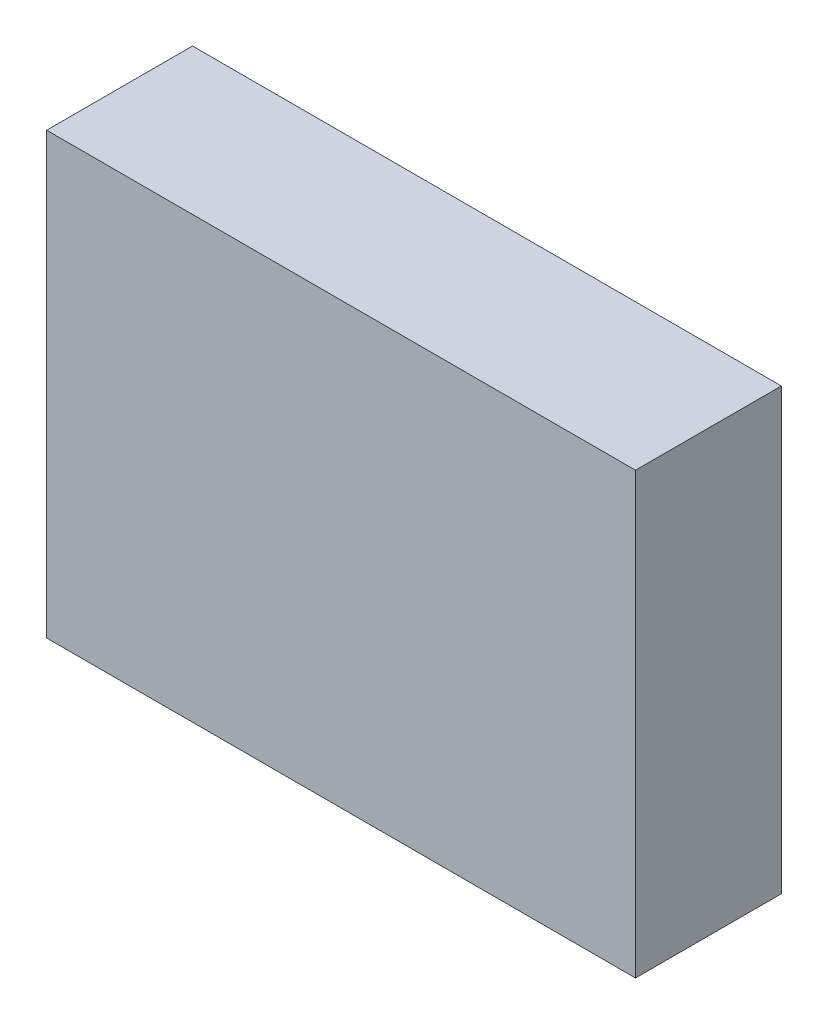
ISO-10303-21;
HEADER;
FILE_DESCRIPTION(('STEP AP214'),'2;1');
FILE_NAME('part.step','',(''),(''),'','','');
FILE_SCHEMA(('AUTOMOTIVE_DESIGN { 1 0 10303 214 1 1 1 1 }'));
ENDSEC;
DATA;
#1=APPLICATION_CONTEXT('core data for automotive mechanical design processes');
#2=APPLICATION_PROTOCOL_DEFINITION('international standard','automotive_design',2000,#1);
#3=PRODUCT_CONTEXT('',#1,'mechanical');
#4=PRODUCT('Part','Part','',(#3));
#5=PRODUCT_RELATED_PRODUCT_CATEGORY('part','',(#4));
#6=PRODUCT_DEFINITION_FORMATION('','',#4);
#7=PRODUCT_DEFINITION_CONTEXT('part definition',#1,'design');
#8=PRODUCT_DEFINITION('design','',#6,#7);
#9=PRODUCT_DEFINITION_SHAPE('','',#8);
#10=(LENGTH_UNIT() NAMED_UNIT(*) SI_UNIT(.MILLI.,.METRE.));
#11=(NAMED_UNIT(*) PLANE_ANGLE_UNIT() SI_UNIT($,.RADIAN.));
#12=(NAMED_UNIT(*) SI_UNIT($,.STERADIAN.) SOLID_ANGLE_UNIT());
#13=UNCERTAINTY_MEASURE_WITH_UNIT(LENGTH_MEASURE(1.E-05),#10,'distance_accuracy_value','');
#14=(GEOMETRIC_REPRESENTATION_CONTEXT(3) GLOBAL_UNCERTAINTY_ASSIGNED_CONTEXT((#13)) GLOBAL_UNIT_ASSIGNED_CONTEXT((#10,
#11,#12)) REPRESENTATION_CONTEXT('',''));
#15=CARTESIAN_POINT('',(0.,0.,0.));
#16=DIRECTION('',(0.,0.,1.));
#17=DIRECTION('',(1.,0.,0.));
#18=AXIS2_PLACEMENT_3D('',#15,#16,#17);
#19=CARTESIAN_POINT('',(30.2779637773868,-22.6120118343195,15.));
#20=DIRECTION('',(-1.,0.,0.));
#21=DIRECTION('',(0.,0.,1.));
#22=AXIS2_PLACEMENT_3D('',#19,#20,#21);
#23=PLANE('',#22);
#24=DIRECTION('',(0.,1.,0.));
#25=VECTOR('',#24,1.);
#26=CARTESIAN_POINT('',(30.2779637773868,-22.6120118343195,0.));
#27=LINE('',#26,#25);
#28=CARTESIAN_POINT('',(30.2779637773868,-22.6120118343195,0.));
#29=VERTEX_POINT('',#28);
#30=CARTESIAN_POINT('',(30.2779637773868,22.6120118343195,0.));
#31=VERTEX_POINT('',#30);
#32=EDGE_CURVE('E96',#29,#31,#27,.T.);
#33=ORIENTED_EDGE('',*,*,#32,.T.);
#34=DIRECTION('',(0.,0.,-1.));
#35=VECTOR('',#34,1.);
#36=CARTESIAN_POINT('',(30.2779637773868,22.6120118343195,15.));
#37=LINE('',#36,#35);
#38=CARTESIAN_POINT('',(30.2779637773868,22.6120118343195,15.));
#39=VERTEX_POINT('',#38);
#40=EDGE_CURVE('E11',#39,#31,#37,.T.);
#41=ORIENTED_EDGE('',*,*,#40,.F.);
#42=DIRECTION('',(0.,1.,0.));
#43=VECTOR('',#42,1.);
#44=CARTESIAN_POINT('',(30.2779637773868,-22.6120118343195,15.));
#45=LINE('',#44,#43);
#46=CARTESIAN_POINT('',(30.2779637773868,-22.6120118343195,15.));
#47=VERTEX_POINT('',#46);
#48=EDGE_CURVE('E84',#47,#39,#45,.T.);
#49=ORIENTED_EDGE('',*,*,#48,.F.);
#50=DIRECTION('',(0.,0.,-1.));
#51=VECTOR('',#50,1.);
#52=CARTESIAN_POINT('',(30.2779637773868,-22.6120118343195,15.));
#53=LINE('',#52,#51);
#54=EDGE_CURVE('E92',#47,#29,#53,.T.);
#55=ORIENTED_EDGE('',*,*,#54,.T.);
#56=EDGE_LOOP('',(#33,#41,#49,#55));
#57=FACE_BOUND('',#56,.T.);
#58=ADVANCED_FACE('F33',(#57),#23,.F.);
#59=CARTESIAN_POINT('',(-30.2779637773868,22.6120118343195,15.));
#60=DIRECTION('',(0.,-1.,0.));
#61=DIRECTION('',(0.,0.,-1.));
#62=AXIS2_PLACEMENT_3D('',#59,#60,#61);
#63=PLANE('',#62);
#64=DIRECTION('',(-1.,0.,0.));
#65=VECTOR('',#64,1.);
#66=CARTESIAN_POINT('',(-30.2779637773868,22.6120118343195,0.));
#67=LINE('',#66,#65);
#68=CARTESIAN_POINT('',(-30.2779637773868,22.6120118343195,0.));
#69=VERTEX_POINT('',#68);
#70=EDGE_CURVE('E88',#31,#69,#67,.T.);
#71=ORIENTED_EDGE('',*,*,#70,.T.);
#72=DIRECTION('',(0.,0.,-1.));
#73=VECTOR('',#72,1.);
#74=CARTESIAN_POINT('',(-30.2779637773868,22.6120118343195,15.));
#75=LINE('',#74,#73);
#76=CARTESIAN_POINT('',(-30.2779637773868,22.6120118343195,15.));
#77=VERTEX_POINT('',#76);
#78=EDGE_CURVE('E41',#77,#69,#75,.T.);
#79=ORIENTED_EDGE('',*,*,#78,.F.);
#80=DIRECTION('',(-1.,0.,0.));
#81=VECTOR('',#80,1.);
#82=CARTESIAN_POINT('',(-30.2779637773868,22.6120118343195,15.));
#83=LINE('',#82,#81);
#84=EDGE_CURVE('E79',#39,#77,#83,.T.);
#85=ORIENTED_EDGE('',*,*,#84,.F.);
#86=ORIENTED_EDGE('',*,*,#40,.T.);
#87=EDGE_LOOP('',(#71,#79,#85,#86));
#88=FACE_BOUND('',#87,.T.);
#89=ADVANCED_FACE('F87',(#88),#63,.F.);
#90=CARTESIAN_POINT('',(-30.2779637773868,-22.6120118343195,15.));
#91=DIRECTION('',(1.,0.,0.));
#92=DIRECTION('',(0.,0.,-1.));
#93=AXIS2_PLACEMENT_3D('',#90,#91,#92);
#94=PLANE('',#93);
#95=DIRECTION('',(0.,-1.,0.));
#96=VECTOR('',#95,1.);
#97=CARTESIAN_POINT('',(-30.2779637773868,-22.6120118343195,0.));
#98=LINE('',#97,#96);
#99=CARTESIAN_POINT('',(-30.2779637773868,-22.6120118343195,0.));
#100=VERTEX_POINT('',#99);
#101=EDGE_CURVE('E66',#69,#100,#98,.T.);
#102=ORIENTED_EDGE('',*,*,#101,.T.);
#103=DIRECTION('',(0.,0.,-1.));
#104=VECTOR('',#103,1.);
#105=CARTESIAN_POINT('',(-30.2779637773868,-22.6120118343195,15.));
#106=LINE('',#105,#104);
#107=CARTESIAN_POINT('',(-30.2779637773868,-22.6120118343195,15.));
#108=VERTEX_POINT('',#107);
#109=EDGE_CURVE('E89',#108,#100,#106,.T.);
#110=ORIENTED_EDGE('',*,*,#109,.F.);
#111=DIRECTION('',(0.,-1.,0.));
#112=VECTOR('',#111,1.);
#113=CARTESIAN_POINT('',(-30.2779637773868,-22.6120118343195,15.));
#114=LINE('',#113,#112);
#115=EDGE_CURVE('E82',#77,#108,#114,.T.);
#116=ORIENTED_EDGE('',*,*,#115,.F.);
#117=ORIENTED_EDGE('',*,*,#78,.T.);
#118=EDGE_LOOP('',(#102,#110,#116,#117));
#119=FACE_BOUND('',#118,.T.);
#120=ADVANCED_FACE('F90',(#119),#94,.F.);
#121=CARTESIAN_POINT('',(-30.2779637773868,-22.6120118343195,15.));
#122=DIRECTION('',(0.,1.,0.));
#123=DIRECTION('',(0.,0.,1.));
#124=AXIS2_PLACEMENT_3D('',#121,#122,#123);
#125=PLANE('',#124);
#126=DIRECTION('',(1.,0.,0.));
#127=VECTOR('',#126,1.);
#128=CARTESIAN_POINT('',(-30.2779637773868,-22.6120118343195,0.));
#129=LINE('',#128,#127);
#130=EDGE_CURVE('E72',#100,#29,#129,.T.);
#131=ORIENTED_EDGE('',*,*,#130,.T.);
#132=ORIENTED_EDGE('',*,*,#54,.F.);
#133=DIRECTION('',(1.,0.,0.));
#134=VECTOR('',#133,1.);
#135=CARTESIAN_POINT('',(-30.2779637773868,-22.6120118343195,15.));
#136=LINE('',#135,#134);
#137=EDGE_CURVE('E49',#108,#47,#136,.T.);
#138=ORIENTED_EDGE('',*,*,#137,.F.);
#139=ORIENTED_EDGE('',*,*,#109,.T.);
#140=EDGE_LOOP('',(#131,#132,#138,#139));
#141=FACE_BOUND('',#140,.T.);
#142=ADVANCED_FACE('F103',(#141),#125,.F.);
#143=CARTESIAN_POINT('',(0.,0.,15.));
#144=DIRECTION('',(0.,0.,-1.));
#145=DIRECTION('',(-1.,0.,0.));
#146=AXIS2_PLACEMENT_3D('',#143,#144,#145);
#147=PLANE('',#146);
#148=ORIENTED_EDGE('',*,*,#48,.T.);
#149=ORIENTED_EDGE('',*,*,#84,.T.);
#150=ORIENTED_EDGE('',*,*,#115,.T.);
#151=ORIENTED_EDGE('',*,*,#137,.T.);
#152=EDGE_LOOP('',(#148,#149,#150,#151));
#153=FACE_BOUND('',#152,.T.);
#154=ADVANCED_FACE('F80',(#153),#147,.F.);
#155=CARTESIAN_POINT('',(0.,0.,0.));
#156=DIRECTION('',(0.,0.,-1.));
#157=DIRECTION('',(-1.,0.,0.));
#158=AXIS2_PLACEMENT_3D('',#155,#156,#157);
#159=PLANE('',#158);
#160=ORIENTED_EDGE('',*,*,#32,.F.);
#161=ORIENTED_EDGE('',*,*,#130,.F.);
#162=ORIENTED_EDGE('',*,*,#101,.F.);
#163=ORIENTED_EDGE('',*,*,#70,.F.);
#164=EDGE_LOOP('',(#160,#161,#162,#163));
#165=FACE_BOUND('',#164,.T.);
#166=ADVANCED_FACE('F106',(#165),#159,.T.);
#167=CLOSED_SHELL('',(#58,#89,#120,#142,#154,#166));
#168=MANIFOLD_SOLID_BREP('B2',#167);
#169=ADVANCED_BREP_SHAPE_REPRESENTATION('',(#18,#168),#14);
#170=SHAPE_DEFINITION_REPRESENTATION(#9,#169);
ENDSEC;
END-ISO-10303-21;
